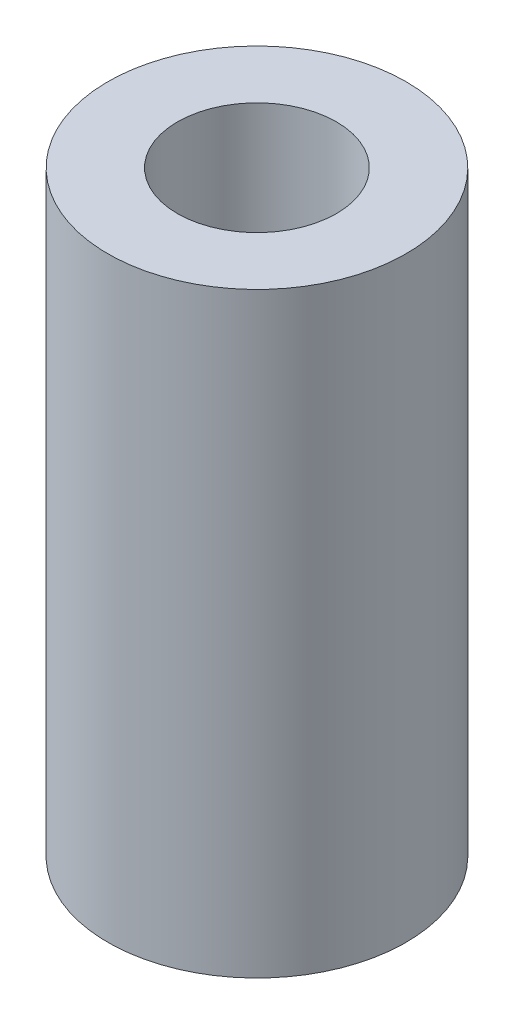
ISO-10303-21;
HEADER;
FILE_DESCRIPTION(('STEP AP214'),'2;1');
FILE_NAME('part.step','',(''),(''),'','','');
FILE_SCHEMA(('AUTOMOTIVE_DESIGN { 1 0 10303 214 1 1 1 1 }'));
ENDSEC;
DATA;
#1=APPLICATION_CONTEXT('core data for automotive mechanical design processes');
#2=APPLICATION_PROTOCOL_DEFINITION('international standard','automotive_design',2000,#1);
#3=PRODUCT_CONTEXT('',#1,'mechanical');
#4=PRODUCT('Part','Part','',(#3));
#5=PRODUCT_RELATED_PRODUCT_CATEGORY('part','',(#4));
#6=PRODUCT_DEFINITION_FORMATION('','',#4);
#7=PRODUCT_DEFINITION_CONTEXT('part definition',#1,'design');
#8=PRODUCT_DEFINITION('design','',#6,#7);
#9=PRODUCT_DEFINITION_SHAPE('','',#8);
#10=(LENGTH_UNIT() NAMED_UNIT(*) SI_UNIT(.MILLI.,.METRE.));
#11=(NAMED_UNIT(*) PLANE_ANGLE_UNIT() SI_UNIT($,.RADIAN.));
#12=(NAMED_UNIT(*) SI_UNIT($,.STERADIAN.) SOLID_ANGLE_UNIT());
#13=UNCERTAINTY_MEASURE_WITH_UNIT(LENGTH_MEASURE(1.E-05),#10,'distance_accuracy_value','');
#14=(GEOMETRIC_REPRESENTATION_CONTEXT(3) GLOBAL_UNCERTAINTY_ASSIGNED_CONTEXT((#13)) GLOBAL_UNIT_ASSIGNED_CONTEXT((#10,
#11,#12)) REPRESENTATION_CONTEXT('',''));
#15=CARTESIAN_POINT('',(0.,0.,0.));
#16=DIRECTION('',(0.,0.,1.));
#17=DIRECTION('',(1.,0.,0.));
#18=AXIS2_PLACEMENT_3D('',#15,#16,#17);
#19=CARTESIAN_POINT('',(0.,12.,0.));
#20=DIRECTION('',(0.,-1.,0.));
#21=DIRECTION('',(0.,0.,-1.));
#22=AXIS2_PLACEMENT_3D('',#19,#20,#21);
#23=CYLINDRICAL_SURFACE('',#22,3.);
#24=CARTESIAN_POINT('',(0.,12.,0.));
#25=DIRECTION('',(0.,-1.,0.));
#26=DIRECTION('',(0.,0.,-1.));
#27=AXIS2_PLACEMENT_3D('',#24,#25,#26);
#28=CIRCLE('',#27,3.);
#29=CARTESIAN_POINT('',(0.,12.,-3.));
#30=VERTEX_POINT('',#29);
#31=EDGE_CURVE('E10',#30,#30,#28,.T.);
#32=ORIENTED_EDGE('',*,*,#31,.T.);
#33=EDGE_LOOP('',(#32));
#34=FACE_BOUND('',#33,.T.);
#35=CARTESIAN_POINT('',(0.,0.,0.));
#36=DIRECTION('',(0.,-1.,0.));
#37=DIRECTION('',(0.,0.,-1.));
#38=AXIS2_PLACEMENT_3D('',#35,#36,#37);
#39=CIRCLE('',#38,3.);
#40=CARTESIAN_POINT('',(0.,0.,-3.));
#41=VERTEX_POINT('',#40);
#42=EDGE_CURVE('E39',#41,#41,#39,.T.);
#43=ORIENTED_EDGE('',*,*,#42,.F.);
#44=EDGE_LOOP('',(#43));
#45=FACE_BOUND('',#44,.T.);
#46=ADVANCED_FACE('F36',(#34,#45),#23,.T.);
#47=CARTESIAN_POINT('',(0.,12.,0.));
#48=DIRECTION('',(0.,-1.,0.));
#49=DIRECTION('',(0.,0.,-1.));
#50=AXIS2_PLACEMENT_3D('',#47,#48,#49);
#51=PLANE('',#50);
#52=CARTESIAN_POINT('',(0.,12.,0.));
#53=DIRECTION('',(0.,-1.,0.));
#54=DIRECTION('',(0.,0.,-1.));
#55=AXIS2_PLACEMENT_3D('',#52,#53,#54);
#56=CIRCLE('',#55,1.6);
#57=CARTESIAN_POINT('',(0.,12.,-1.6));
#58=VERTEX_POINT('',#57);
#59=EDGE_CURVE('E46',#58,#58,#56,.T.);
#60=ORIENTED_EDGE('',*,*,#59,.T.);
#61=EDGE_LOOP('',(#60));
#62=FACE_BOUND('',#61,.T.);
#63=ORIENTED_EDGE('',*,*,#31,.F.);
#64=EDGE_LOOP('',(#63));
#65=FACE_BOUND('',#64,.T.);
#66=ADVANCED_FACE('F54',(#62,#65),#51,.F.);
#67=CARTESIAN_POINT('',(0.,0.,0.));
#68=DIRECTION('',(0.,-1.,0.));
#69=DIRECTION('',(0.,0.,-1.));
#70=AXIS2_PLACEMENT_3D('',#67,#68,#69);
#71=PLANE('',#70);
#72=CARTESIAN_POINT('',(0.,0.,0.));
#73=DIRECTION('',(0.,-1.,0.));
#74=DIRECTION('',(0.,0.,-1.));
#75=AXIS2_PLACEMENT_3D('',#72,#73,#74);
#76=CIRCLE('',#75,1.6);
#77=CARTESIAN_POINT('',(0.,0.,-1.6));
#78=VERTEX_POINT('',#77);
#79=EDGE_CURVE('E48',#78,#78,#76,.T.);
#80=ORIENTED_EDGE('',*,*,#79,.F.);
#81=EDGE_LOOP('',(#80));
#82=FACE_BOUND('',#81,.T.);
#83=ORIENTED_EDGE('',*,*,#42,.T.);
#84=EDGE_LOOP('',(#83));
#85=FACE_BOUND('',#84,.T.);
#86=ADVANCED_FACE('F60',(#82,#85),#71,.T.);
#87=CARTESIAN_POINT('',(0.,12.,0.));
#88=DIRECTION('',(0.,-1.,0.));
#89=DIRECTION('',(0.,0.,-1.));
#90=AXIS2_PLACEMENT_3D('',#87,#88,#89);
#91=CYLINDRICAL_SURFACE('',#90,1.6);
#92=ORIENTED_EDGE('',*,*,#59,.F.);
#93=EDGE_LOOP('',(#92));
#94=FACE_BOUND('',#93,.T.);
#95=ORIENTED_EDGE('',*,*,#79,.T.);
#96=EDGE_LOOP('',(#95));
#97=FACE_BOUND('',#96,.T.);
#98=ADVANCED_FACE('F57',(#94,#97),#91,.F.);
#99=CLOSED_SHELL('',(#46,#66,#86,#98));
#100=MANIFOLD_SOLID_BREP('B2',#99);
#101=ADVANCED_BREP_SHAPE_REPRESENTATION('',(#18,#100),#14);
#102=SHAPE_DEFINITION_REPRESENTATION(#9,#101);
ENDSEC;
END-ISO-10303-21;
